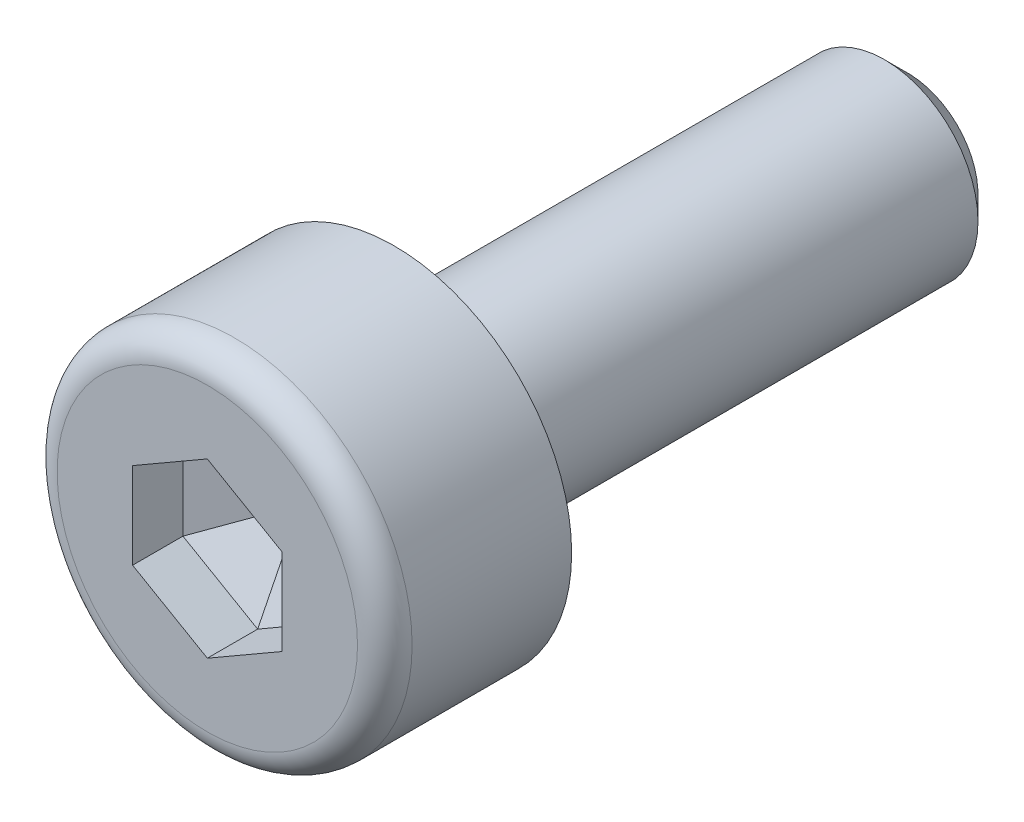
ISO-10303-21;
HEADER;
FILE_DESCRIPTION(('STEP AP214'),'2;1');
FILE_NAME('part.step','',(''),(''),'','','');
FILE_SCHEMA(('AUTOMOTIVE_DESIGN { 1 0 10303 214 1 1 1 1 }'));
ENDSEC;
DATA;
#1=APPLICATION_CONTEXT('core data for automotive mechanical design processes');
#2=APPLICATION_PROTOCOL_DEFINITION('international standard','automotive_design',2000,#1);
#3=PRODUCT_CONTEXT('',#1,'mechanical');
#4=PRODUCT('Part','Part','',(#3));
#5=PRODUCT_RELATED_PRODUCT_CATEGORY('part','',(#4));
#6=PRODUCT_DEFINITION_FORMATION('','',#4);
#7=PRODUCT_DEFINITION_CONTEXT('part definition',#1,'design');
#8=PRODUCT_DEFINITION('design','',#6,#7);
#9=PRODUCT_DEFINITION_SHAPE('','',#8);
#10=(LENGTH_UNIT() NAMED_UNIT(*) SI_UNIT(.MILLI.,.METRE.));
#11=(NAMED_UNIT(*) PLANE_ANGLE_UNIT() SI_UNIT($,.RADIAN.));
#12=(NAMED_UNIT(*) SI_UNIT($,.STERADIAN.) SOLID_ANGLE_UNIT());
#13=UNCERTAINTY_MEASURE_WITH_UNIT(LENGTH_MEASURE(1.E-05),#10,'distance_accuracy_value','');
#14=(GEOMETRIC_REPRESENTATION_CONTEXT(3) GLOBAL_UNCERTAINTY_ASSIGNED_CONTEXT((#13)) GLOBAL_UNIT_ASSIGNED_CONTEXT((#10,
#11,#12)) REPRESENTATION_CONTEXT('',''));
#15=CARTESIAN_POINT('',(0.,0.,0.));
#16=DIRECTION('',(0.,0.,1.));
#17=DIRECTION('',(1.,0.,0.));
#18=AXIS2_PLACEMENT_3D('',#15,#16,#17);
#19=CARTESIAN_POINT('',(0.,0.,0.));
#20=DIRECTION('',(0.,0.,1.));
#21=DIRECTION('',(1.,0.,0.));
#22=AXIS2_PLACEMENT_3D('',#19,#20,#21);
#23=PLANE('',#22);
#24=CARTESIAN_POINT('',(0.,0.,0.));
#25=DIRECTION('',(0.,0.,1.));
#26=DIRECTION('',(1.,0.,0.));
#27=AXIS2_PLACEMENT_3D('',#24,#25,#26);
#28=CIRCLE('',#27,1.1);
#29=CARTESIAN_POINT('',(1.1,0.,0.));
#30=VERTEX_POINT('',#29);
#31=EDGE_CURVE('E11',#30,#30,#28,.T.);
#32=ORIENTED_EDGE('',*,*,#31,.T.);
#33=EDGE_LOOP('',(#32));
#34=FACE_BOUND('',#33,.T.);
#35=CARTESIAN_POINT('',(0.,0.,0.));
#36=DIRECTION('',(0.,0.,1.));
#37=DIRECTION('',(1.,0.,0.));
#38=AXIS2_PLACEMENT_3D('',#35,#36,#37);
#39=CIRCLE('',#38,1.9);
#40=CARTESIAN_POINT('',(1.9,0.,0.));
#41=VERTEX_POINT('',#40);
#42=EDGE_CURVE('E159',#41,#41,#39,.T.);
#43=ORIENTED_EDGE('',*,*,#42,.F.);
#44=EDGE_LOOP('',(#43));
#45=FACE_BOUND('',#44,.T.);
#46=ADVANCED_FACE('F49',(#34,#45),#23,.F.);
#47=CARTESIAN_POINT('',(0.,0.,2.));
#48=DIRECTION('',(0.,0.,-1.));
#49=DIRECTION('',(-1.,0.,0.));
#50=AXIS2_PLACEMENT_3D('',#47,#48,#49);
#51=CYLINDRICAL_SURFACE('',#50,1.9);
#52=CARTESIAN_POINT('',(0.,0.,1.70769230769231));
#53=DIRECTION('',(0.,0.,1.));
#54=DIRECTION('',(1.,0.,0.));
#55=AXIS2_PLACEMENT_3D('',#52,#53,#54);
#56=CIRCLE('',#55,1.9);
#57=CARTESIAN_POINT('',(1.9,0.,1.70769230769231));
#58=VERTEX_POINT('',#57);
#59=EDGE_CURVE('E177',#58,#58,#56,.F.);
#60=ORIENTED_EDGE('',*,*,#59,.T.);
#61=EDGE_LOOP('',(#60));
#62=FACE_BOUND('',#61,.T.);
#63=ORIENTED_EDGE('',*,*,#42,.T.);
#64=EDGE_LOOP('',(#63));
#65=FACE_BOUND('',#64,.T.);
#66=ADVANCED_FACE('F236',(#62,#65),#51,.T.);
#67=CARTESIAN_POINT('',(0.,0.,2.));
#68=DIRECTION('',(0.,0.,1.));
#69=DIRECTION('',(1.,0.,0.));
#70=AXIS2_PLACEMENT_3D('',#67,#68,#69);
#71=PLANE('',#70);
#72=CARTESIAN_POINT('',(0.,0.,2.));
#73=DIRECTION('',(0.,0.,1.));
#74=DIRECTION('',(1.,0.,0.));
#75=AXIS2_PLACEMENT_3D('',#72,#73,#74);
#76=CIRCLE('',#75,1.60769230769231);
#77=CARTESIAN_POINT('',(1.60769230769231,0.,2.));
#78=VERTEX_POINT('',#77);
#79=EDGE_CURVE('E174',#78,#78,#76,.T.);
#80=ORIENTED_EDGE('',*,*,#79,.T.);
#81=EDGE_LOOP('',(#80));
#82=FACE_BOUND('',#81,.T.);
#83=DIRECTION('',(0.,1.,0.));
#84=VECTOR('',#83,1.);
#85=CARTESIAN_POINT('',(0.8,-0.461880215351701,2.));
#86=LINE('',#85,#84);
#87=CARTESIAN_POINT('',(0.8,-0.461880215351701,2.));
#88=VERTEX_POINT('',#87);
#89=CARTESIAN_POINT('',(0.8,0.461880215351701,2.));
#90=VERTEX_POINT('',#89);
#91=EDGE_CURVE('E141',#88,#90,#86,.T.);
#92=ORIENTED_EDGE('',*,*,#91,.F.);
#93=DIRECTION('',(0.866025403784439,0.5,0.));
#94=VECTOR('',#93,1.);
#95=CARTESIAN_POINT('',(0.,-0.923760430703401,2.));
#96=LINE('',#95,#94);
#97=CARTESIAN_POINT('',(0.,-0.923760430703401,2.));
#98=VERTEX_POINT('',#97);
#99=EDGE_CURVE('E154',#98,#88,#96,.T.);
#100=ORIENTED_EDGE('',*,*,#99,.F.);
#101=DIRECTION('',(0.866025403784439,-0.5,0.));
#102=VECTOR('',#101,1.);
#103=CARTESIAN_POINT('',(-0.8,-0.4618802153517,2.));
#104=LINE('',#103,#102);
#105=CARTESIAN_POINT('',(-0.8,-0.4618802153517,2.));
#106=VERTEX_POINT('',#105);
#107=EDGE_CURVE('E148',#106,#98,#104,.T.);
#108=ORIENTED_EDGE('',*,*,#107,.F.);
#109=DIRECTION('',(0.,-1.,0.));
#110=VECTOR('',#109,1.);
#111=CARTESIAN_POINT('',(-0.8,0.461880215351701,2.));
#112=LINE('',#111,#110);
#113=CARTESIAN_POINT('',(-0.8,0.461880215351701,2.));
#114=VERTEX_POINT('',#113);
#115=EDGE_CURVE('E146',#114,#106,#112,.T.);
#116=ORIENTED_EDGE('',*,*,#115,.F.);
#117=DIRECTION('',(-0.866025403784439,-0.5,0.));
#118=VECTOR('',#117,1.);
#119=CARTESIAN_POINT('',(0.,0.923760430703401,2.));
#120=LINE('',#119,#118);
#121=CARTESIAN_POINT('',(0.,0.923760430703401,2.));
#122=VERTEX_POINT('',#121);
#123=EDGE_CURVE('E126',#122,#114,#120,.T.);
#124=ORIENTED_EDGE('',*,*,#123,.F.);
#125=DIRECTION('',(-0.866025403784439,0.5,0.));
#126=VECTOR('',#125,1.);
#127=CARTESIAN_POINT('',(0.8,0.461880215351701,2.));
#128=LINE('',#127,#126);
#129=EDGE_CURVE('E136',#90,#122,#128,.T.);
#130=ORIENTED_EDGE('',*,*,#129,.F.);
#131=EDGE_LOOP('',(#92,#100,#108,#116,#124,#130));
#132=FACE_BOUND('',#131,.T.);
#133=ADVANCED_FACE('F143',(#82,#132),#71,.T.);
#134=CARTESIAN_POINT('',(0.8,-0.461880215351701,1.));
#135=DIRECTION('',(1.,0.,0.));
#136=DIRECTION('',(0.,1.,0.));
#137=AXIS2_PLACEMENT_3D('',#134,#135,#136);
#138=PLANE('',#137);
#139=DIRECTION('',(0.,0.,1.));
#140=VECTOR('',#139,1.);
#141=CARTESIAN_POINT('',(0.8,0.461880215351701,1.));
#142=LINE('',#141,#140);
#143=CARTESIAN_POINT('',(0.8,0.461880215351701,1.46109510086455));
#144=VERTEX_POINT('',#143);
#145=EDGE_CURVE('E133',#144,#90,#142,.T.);
#146=ORIENTED_EDGE('',*,*,#145,.F.);
#147=DIRECTION('',(0.,-1.,0.));
#148=VECTOR('',#147,1.);
#149=CARTESIAN_POINT('',(0.8,-0.461880215351701,1.46109510086455));
#150=LINE('',#149,#148);
#151=CARTESIAN_POINT('',(0.8,-0.461880215351701,1.46109510086455));
#152=VERTEX_POINT('',#151);
#153=EDGE_CURVE('E72',#144,#152,#150,.T.);
#154=ORIENTED_EDGE('',*,*,#153,.T.);
#155=DIRECTION('',(0.,0.,1.));
#156=VECTOR('',#155,1.);
#157=CARTESIAN_POINT('',(0.8,-0.461880215351701,1.));
#158=LINE('',#157,#156);
#159=EDGE_CURVE('E157',#152,#88,#158,.T.);
#160=ORIENTED_EDGE('',*,*,#159,.T.);
#161=ORIENTED_EDGE('',*,*,#91,.T.);
#162=EDGE_LOOP('',(#146,#154,#160,#161));
#163=FACE_BOUND('',#162,.T.);
#164=ADVANCED_FACE('F296',(#163),#138,.F.);
#165=CARTESIAN_POINT('',(0.,-0.923760430703401,1.));
#166=DIRECTION('',(0.5,-0.866025403784439,0.));
#167=DIRECTION('',(0.866025403784439,0.5,0.));
#168=AXIS2_PLACEMENT_3D('',#165,#166,#167);
#169=PLANE('',#168);
#170=ORIENTED_EDGE('',*,*,#159,.F.);
#171=DIRECTION('',(-0.866025403784439,-0.5,0.));
#172=VECTOR('',#171,1.);
#173=CARTESIAN_POINT('',(0.,-0.923760430703401,1.46109510086455));
#174=LINE('',#173,#172);
#175=CARTESIAN_POINT('',(0.,-0.923760430703401,1.46109510086455));
#176=VERTEX_POINT('',#175);
#177=EDGE_CURVE('E64',#152,#176,#174,.T.);
#178=ORIENTED_EDGE('',*,*,#177,.T.);
#179=DIRECTION('',(0.,0.,1.));
#180=VECTOR('',#179,1.);
#181=CARTESIAN_POINT('',(0.,-0.923760430703401,1.));
#182=LINE('',#181,#180);
#183=EDGE_CURVE('E160',#176,#98,#182,.T.);
#184=ORIENTED_EDGE('',*,*,#183,.T.);
#185=ORIENTED_EDGE('',*,*,#99,.T.);
#186=EDGE_LOOP('',(#170,#178,#184,#185));
#187=FACE_BOUND('',#186,.T.);
#188=ADVANCED_FACE('F298',(#187),#169,.F.);
#189=CARTESIAN_POINT('',(-0.8,-0.4618802153517,1.));
#190=DIRECTION('',(-0.5,-0.866025403784439,0.));
#191=DIRECTION('',(0.866025403784439,-0.5,0.));
#192=AXIS2_PLACEMENT_3D('',#189,#190,#191);
#193=PLANE('',#192);
#194=ORIENTED_EDGE('',*,*,#183,.F.);
#195=DIRECTION('',(-0.866025403784439,0.5,0.));
#196=VECTOR('',#195,1.);
#197=CARTESIAN_POINT('',(-0.8,-0.4618802153517,1.46109510086455));
#198=LINE('',#197,#196);
#199=CARTESIAN_POINT('',(-0.8,-0.4618802153517,1.46109510086455));
#200=VERTEX_POINT('',#199);
#201=EDGE_CURVE('E200',#176,#200,#198,.T.);
#202=ORIENTED_EDGE('',*,*,#201,.T.);
#203=DIRECTION('',(0.,0.,1.));
#204=VECTOR('',#203,1.);
#205=CARTESIAN_POINT('',(-0.8,-0.4618802153517,1.));
#206=LINE('',#205,#204);
#207=EDGE_CURVE('E162',#200,#106,#206,.T.);
#208=ORIENTED_EDGE('',*,*,#207,.T.);
#209=ORIENTED_EDGE('',*,*,#107,.T.);
#210=EDGE_LOOP('',(#194,#202,#208,#209));
#211=FACE_BOUND('',#210,.T.);
#212=ADVANCED_FACE('F287',(#211),#193,.F.);
#213=CARTESIAN_POINT('',(-0.8,0.461880215351701,1.));
#214=DIRECTION('',(-1.,0.,0.));
#215=DIRECTION('',(0.,0.,1.));
#216=AXIS2_PLACEMENT_3D('',#213,#214,#215);
#217=PLANE('',#216);
#218=ORIENTED_EDGE('',*,*,#207,.F.);
#219=DIRECTION('',(0.,1.,0.));
#220=VECTOR('',#219,1.);
#221=CARTESIAN_POINT('',(-0.8,0.461880215351701,1.46109510086455));
#222=LINE('',#221,#220);
#223=CARTESIAN_POINT('',(-0.8,0.461880215351701,1.46109510086455));
#224=VERTEX_POINT('',#223);
#225=EDGE_CURVE('E193',#200,#224,#222,.T.);
#226=ORIENTED_EDGE('',*,*,#225,.T.);
#227=DIRECTION('',(0.,0.,1.));
#228=VECTOR('',#227,1.);
#229=CARTESIAN_POINT('',(-0.8,0.461880215351701,1.));
#230=LINE('',#229,#228);
#231=EDGE_CURVE('E132',#224,#114,#230,.T.);
#232=ORIENTED_EDGE('',*,*,#231,.T.);
#233=ORIENTED_EDGE('',*,*,#115,.T.);
#234=EDGE_LOOP('',(#218,#226,#232,#233));
#235=FACE_BOUND('',#234,.T.);
#236=ADVANCED_FACE('F290',(#235),#217,.F.);
#237=CARTESIAN_POINT('',(0.,0.923760430703401,1.));
#238=DIRECTION('',(-0.5,0.866025403784439,0.));
#239=DIRECTION('',(-0.866025403784439,-0.5,0.));
#240=AXIS2_PLACEMENT_3D('',#237,#238,#239);
#241=PLANE('',#240);
#242=ORIENTED_EDGE('',*,*,#231,.F.);
#243=DIRECTION('',(0.866025403784439,0.5,0.));
#244=VECTOR('',#243,1.);
#245=CARTESIAN_POINT('',(0.,0.923760430703401,1.46109510086455));
#246=LINE('',#245,#244);
#247=CARTESIAN_POINT('',(0.,0.923760430703401,1.46109510086455));
#248=VERTEX_POINT('',#247);
#249=EDGE_CURVE('E129',#224,#248,#246,.T.);
#250=ORIENTED_EDGE('',*,*,#249,.T.);
#251=DIRECTION('',(0.,0.,1.));
#252=VECTOR('',#251,1.);
#253=CARTESIAN_POINT('',(0.,0.923760430703401,1.));
#254=LINE('',#253,#252);
#255=EDGE_CURVE('E121',#248,#122,#254,.T.);
#256=ORIENTED_EDGE('',*,*,#255,.T.);
#257=ORIENTED_EDGE('',*,*,#123,.T.);
#258=EDGE_LOOP('',(#242,#250,#256,#257));
#259=FACE_BOUND('',#258,.T.);
#260=ADVANCED_FACE('F124',(#259),#241,.F.);
#261=CARTESIAN_POINT('',(0.8,0.461880215351701,1.));
#262=DIRECTION('',(0.5,0.866025403784439,0.));
#263=DIRECTION('',(-0.866025403784439,0.5,0.));
#264=AXIS2_PLACEMENT_3D('',#261,#262,#263);
#265=PLANE('',#264);
#266=ORIENTED_EDGE('',*,*,#255,.F.);
#267=DIRECTION('',(0.866025403784439,-0.5,0.));
#268=VECTOR('',#267,1.);
#269=CARTESIAN_POINT('',(0.8,0.461880215351701,1.46109510086455));
#270=LINE('',#269,#268);
#271=EDGE_CURVE('E197',#248,#144,#270,.T.);
#272=ORIENTED_EDGE('',*,*,#271,.T.);
#273=ORIENTED_EDGE('',*,*,#145,.T.);
#274=ORIENTED_EDGE('',*,*,#129,.T.);
#275=EDGE_LOOP('',(#266,#272,#273,#274));
#276=FACE_BOUND('',#275,.T.);
#277=ADVANCED_FACE('F137',(#276),#265,.F.);
#278=CARTESIAN_POINT('',(0.,0.,1.));
#279=DIRECTION('',(0.,0.,1.));
#280=DIRECTION('',(1.,0.,0.));
#281=AXIS2_PLACEMENT_3D('',#278,#279,#280);
#282=PLANE('',#281);
#283=DIRECTION('',(-0.866025403784439,-0.5,0.));
#284=VECTOR('',#283,1.);
#285=CARTESIAN_POINT('',(-0.000679929090744374,0.00117767173071337,1.));
#286=LINE('',#285,#284);
#287=CARTESIAN_POINT('',(0.,0.0015702289742842,1.));
#288=VERTEX_POINT('',#287);
#289=CARTESIAN_POINT('',(-0.00135985818148849,0.0007851144871424,1.));
#290=VERTEX_POINT('',#289);
#291=EDGE_CURVE('E188',#288,#290,#286,.T.);
#292=ORIENTED_EDGE('',*,*,#291,.T.);
#293=DIRECTION('',(0.,-1.,0.));
#294=VECTOR('',#293,1.);
#295=CARTESIAN_POINT('',(-0.00135985818148848,0.,1.));
#296=LINE('',#295,#294);
#297=CARTESIAN_POINT('',(-0.00135985818148848,-0.000785114487141747,1.));
#298=VERTEX_POINT('',#297);
#299=EDGE_CURVE('E190',#290,#298,#296,.T.);
#300=ORIENTED_EDGE('',*,*,#299,.T.);
#301=DIRECTION('',(0.866025403784439,-0.5,0.));
#302=VECTOR('',#301,1.);
#303=CARTESIAN_POINT('',(-0.000679929090744089,-0.00117767173071287,1.));
#304=LINE('',#303,#302);
#305=CARTESIAN_POINT('',(0.,-0.00157022897428431,1.));
#306=VERTEX_POINT('',#305);
#307=EDGE_CURVE('E182',#298,#306,#304,.T.);
#308=ORIENTED_EDGE('',*,*,#307,.T.);
#309=DIRECTION('',(0.866025403784439,0.5,0.));
#310=VECTOR('',#309,1.);
#311=CARTESIAN_POINT('',(0.000679929090744482,-0.00117767173071355,1.));
#312=LINE('',#311,#310);
#313=CARTESIAN_POINT('',(0.00135985818148853,-0.000785114487142602,1.));
#314=VERTEX_POINT('',#313);
#315=EDGE_CURVE('E180',#306,#314,#312,.T.);
#316=ORIENTED_EDGE('',*,*,#315,.T.);
#317=DIRECTION('',(0.,1.,0.));
#318=VECTOR('',#317,1.);
#319=CARTESIAN_POINT('',(0.00135985818148853,0.,1.));
#320=LINE('',#319,#318);
#321=CARTESIAN_POINT('',(0.00135985818148853,0.000785114487141799,1.));
#322=VERTEX_POINT('',#321);
#323=EDGE_CURVE('E184',#314,#322,#320,.T.);
#324=ORIENTED_EDGE('',*,*,#323,.T.);
#325=DIRECTION('',(-0.866025403784439,0.5,0.));
#326=VECTOR('',#325,1.);
#327=CARTESIAN_POINT('',(0.00067992909074413,0.00117767173071294,1.));
#328=LINE('',#327,#326);
#329=EDGE_CURVE('E186',#322,#288,#328,.T.);
#330=ORIENTED_EDGE('',*,*,#329,.T.);
#331=EDGE_LOOP('',(#292,#300,#308,#316,#324,#330));
#332=FACE_BOUND('',#331,.T.);
#333=ADVANCED_FACE('F307',(#332),#282,.T.);
#334=CARTESIAN_POINT('',(0.,0.,-5.5));
#335=DIRECTION('',(0.,0.,1.));
#336=DIRECTION('',(1.,0.,0.));
#337=AXIS2_PLACEMENT_3D('',#334,#335,#336);
#338=CYLINDRICAL_SURFACE('',#337,1.);
#339=CARTESIAN_POINT('',(0.,0.,-0.1));
#340=DIRECTION('',(0.,0.,1.));
#341=DIRECTION('',(1.,0.,0.));
#342=AXIS2_PLACEMENT_3D('',#339,#340,#341);
#343=CIRCLE('',#342,1.);
#344=CARTESIAN_POINT('',(1.,0.,-0.1));
#345=VERTEX_POINT('',#344);
#346=EDGE_CURVE('E57',#345,#345,#343,.F.);
#347=ORIENTED_EDGE('',*,*,#346,.T.);
#348=EDGE_LOOP('',(#347));
#349=FACE_BOUND('',#348,.T.);
#350=CARTESIAN_POINT('',(0.,0.,-5.25));
#351=DIRECTION('',(0.,0.,-1.));
#352=DIRECTION('',(-1.,0.,0.));
#353=AXIS2_PLACEMENT_3D('',#350,#351,#352);
#354=CIRCLE('',#353,1.);
#355=CARTESIAN_POINT('',(-1.,0.,-5.25));
#356=VERTEX_POINT('',#355);
#357=EDGE_CURVE('E171',#356,#356,#354,.F.);
#358=ORIENTED_EDGE('',*,*,#357,.T.);
#359=EDGE_LOOP('',(#358));
#360=FACE_BOUND('',#359,.T.);
#361=ADVANCED_FACE('F221',(#349,#360),#338,.T.);
#362=CARTESIAN_POINT('',(0.,0.,-5.5));
#363=DIRECTION('',(0.,0.,-1.));
#364=DIRECTION('',(-1.,0.,0.));
#365=AXIS2_PLACEMENT_3D('',#362,#363,#364);
#366=PLANE('',#365);
#367=CARTESIAN_POINT('',(0.,0.,-5.5));
#368=DIRECTION('',(0.,0.,-1.));
#369=DIRECTION('',(-1.,0.,0.));
#370=AXIS2_PLACEMENT_3D('',#367,#368,#369);
#371=CIRCLE('',#370,0.75);
#372=CARTESIAN_POINT('',(-0.75,0.,-5.5));
#373=VERTEX_POINT('',#372);
#374=EDGE_CURVE('E168',#373,#373,#371,.T.);
#375=ORIENTED_EDGE('',*,*,#374,.T.);
#376=EDGE_LOOP('',(#375));
#377=FACE_BOUND('',#376,.T.);
#378=ADVANCED_FACE('F252',(#377),#366,.T.);
#379=CARTESIAN_POINT('',(0.,0.,-5.5));
#380=DIRECTION('',(0.,0.,1.));
#381=DIRECTION('',(1.,0.,0.));
#382=AXIS2_PLACEMENT_3D('',#379,#380,#381);
#383=CONICAL_SURFACE('',#382,0.75,0.785398163397447);
#384=ORIENTED_EDGE('',*,*,#357,.F.);
#385=EDGE_LOOP('',(#384));
#386=FACE_BOUND('',#385,.T.);
#387=ORIENTED_EDGE('',*,*,#374,.F.);
#388=EDGE_LOOP('',(#387));
#389=FACE_BOUND('',#388,.T.);
#390=ADVANCED_FACE('F248',(#386,#389),#383,.T.);
#391=CARTESIAN_POINT('',(0.,0.,1.70769230769231));
#392=DIRECTION('',(0.,0.,1.));
#393=DIRECTION('',(1.,0.,0.));
#394=AXIS2_PLACEMENT_3D('',#391,#392,#393);
#395=TOROIDAL_SURFACE('',#394,1.60769230769231,0.292307692307692);
#396=ORIENTED_EDGE('',*,*,#59,.F.);
#397=EDGE_LOOP('',(#396));
#398=FACE_BOUND('',#397,.T.);
#399=ORIENTED_EDGE('',*,*,#79,.F.);
#400=EDGE_LOOP('',(#399));
#401=FACE_BOUND('',#400,.T.);
#402=ADVANCED_FACE('F251',(#398,#401),#395,.T.);
#403=CARTESIAN_POINT('',(0.00135985818148853,0.,1.));
#404=DIRECTION('',(0.499999999999995,0.,-0.866025403784442));
#405=DIRECTION('',(0.,1.,0.));
#406=AXIS2_PLACEMENT_3D('',#403,#404,#405);
#407=PLANE('',#406);
#408=DIRECTION('',(-0.774596669241486,0.447213595499959,-0.447213595499953));
#409=VECTOR('',#408,1.);
#410=CARTESIAN_POINT('',(0.00108788654519065,-0.000628091589714094,0.999842977102572));
#411=LINE('',#410,#409);
#412=EDGE_CURVE('E213',#152,#314,#411,.T.);
#413=ORIENTED_EDGE('',*,*,#412,.F.);
#414=ORIENTED_EDGE('',*,*,#153,.F.);
#415=DIRECTION('',(-0.774596669241485,-0.44721359549996,-0.447213595499953));
#416=VECTOR('',#415,1.);
#417=CARTESIAN_POINT('',(0.00108788654519076,0.000628091589713315,0.999842977102572));
#418=LINE('',#417,#416);
#419=EDGE_CURVE('E216',#322,#144,#418,.F.);
#420=ORIENTED_EDGE('',*,*,#419,.F.);
#421=ORIENTED_EDGE('',*,*,#323,.F.);
#422=EDGE_LOOP('',(#413,#414,#420,#421));
#423=FACE_BOUND('',#422,.T.);
#424=ADVANCED_FACE('F255',(#423),#407,.F.);
#425=CARTESIAN_POINT('',(0.000679929090744116,0.00117767173071292,1.));
#426=DIRECTION('',(0.249999999999997,0.433012701892215,-0.866025403784442));
#427=DIRECTION('',(-0.866025403784439,0.5,0.));
#428=AXIS2_PLACEMENT_3D('',#425,#426,#427);
#429=PLANE('',#428);
#430=ORIENTED_EDGE('',*,*,#419,.T.);
#431=ORIENTED_EDGE('',*,*,#271,.F.);
#432=DIRECTION('',(0.,-0.894427190999918,-0.447213595499953));
#433=VECTOR('',#432,1.);
#434=CARTESIAN_POINT('',(0.,0.00125618317942748,0.999842977102572));
#435=LINE('',#434,#433);
#436=EDGE_CURVE('E210',#288,#248,#435,.F.);
#437=ORIENTED_EDGE('',*,*,#436,.F.);
#438=ORIENTED_EDGE('',*,*,#329,.F.);
#439=EDGE_LOOP('',(#430,#431,#437,#438));
#440=FACE_BOUND('',#439,.T.);
#441=ADVANCED_FACE('F268',(#440),#429,.F.);
#442=CARTESIAN_POINT('',(0.000679929090744482,-0.00117767173071355,1.));
#443=DIRECTION('',(0.249999999999997,-0.433012701892215,-0.866025403784442));
#444=DIRECTION('',(0.866025403784439,0.5,0.));
#445=AXIS2_PLACEMENT_3D('',#442,#443,#444);
#446=PLANE('',#445);
#447=ORIENTED_EDGE('',*,*,#412,.T.);
#448=ORIENTED_EDGE('',*,*,#315,.F.);
#449=DIRECTION('',(0.,-0.894427190999919,0.447213595499953));
#450=VECTOR('',#449,1.);
#451=CARTESIAN_POINT('',(0.,-0.00125618317942715,0.999842977102572));
#452=LINE('',#451,#450);
#453=EDGE_CURVE('E207',#176,#306,#452,.F.);
#454=ORIENTED_EDGE('',*,*,#453,.F.);
#455=ORIENTED_EDGE('',*,*,#177,.F.);
#456=EDGE_LOOP('',(#447,#448,#454,#455));
#457=FACE_BOUND('',#456,.T.);
#458=ADVANCED_FACE('F264',(#457),#446,.F.);
#459=CARTESIAN_POINT('',(-0.000679929090744346,0.00117767173071332,1.));
#460=DIRECTION('',(-0.249999999999997,0.433012701892215,-0.866025403784442));
#461=DIRECTION('',(-0.866025403784439,-0.5,0.));
#462=AXIS2_PLACEMENT_3D('',#459,#460,#461);
#463=PLANE('',#462);
#464=ORIENTED_EDGE('',*,*,#436,.T.);
#465=ORIENTED_EDGE('',*,*,#249,.F.);
#466=DIRECTION('',(0.774596669241486,-0.447213595499959,-0.447213595499953));
#467=VECTOR('',#466,1.);
#468=CARTESIAN_POINT('',(-0.00108788654519069,0.000628091589713869,0.999842977102572));
#469=LINE('',#468,#467);
#470=EDGE_CURVE('E205',#290,#224,#469,.F.);
#471=ORIENTED_EDGE('',*,*,#470,.F.);
#472=ORIENTED_EDGE('',*,*,#291,.F.);
#473=EDGE_LOOP('',(#464,#465,#471,#472));
#474=FACE_BOUND('',#473,.T.);
#475=ADVANCED_FACE('F260',(#474),#463,.F.);
#476=CARTESIAN_POINT('',(-0.000679929090744089,-0.00117767173071287,1.));
#477=DIRECTION('',(-0.249999999999997,-0.433012701892215,-0.866025403784442));
#478=DIRECTION('',(0.866025403784439,-0.5,0.));
#479=AXIS2_PLACEMENT_3D('',#476,#477,#478);
#480=PLANE('',#479);
#481=ORIENTED_EDGE('',*,*,#453,.T.);
#482=ORIENTED_EDGE('',*,*,#307,.F.);
#483=DIRECTION('',(-0.774596669241485,-0.447213595499959,0.447213595499953));
#484=VECTOR('',#483,1.);
#485=CARTESIAN_POINT('',(-0.0010878865451909,-0.000628091589713393,0.999842977102572));
#486=LINE('',#485,#484);
#487=EDGE_CURVE('E203',#200,#298,#486,.F.);
#488=ORIENTED_EDGE('',*,*,#487,.F.);
#489=ORIENTED_EDGE('',*,*,#201,.F.);
#490=EDGE_LOOP('',(#481,#482,#488,#489));
#491=FACE_BOUND('',#490,.T.);
#492=ADVANCED_FACE('F231',(#491),#480,.F.);
#493=CARTESIAN_POINT('',(-0.00135985818148848,0.,1.));
#494=DIRECTION('',(-0.499999999999995,0.,-0.866025403784442));
#495=DIRECTION('',(0.,-1.,0.));
#496=AXIS2_PLACEMENT_3D('',#493,#494,#495);
#497=PLANE('',#496);
#498=ORIENTED_EDGE('',*,*,#470,.T.);
#499=ORIENTED_EDGE('',*,*,#225,.F.);
#500=ORIENTED_EDGE('',*,*,#487,.T.);
#501=ORIENTED_EDGE('',*,*,#299,.F.);
#502=EDGE_LOOP('',(#498,#499,#500,#501));
#503=FACE_BOUND('',#502,.T.);
#504=ADVANCED_FACE('F225',(#503),#497,.F.);
#505=CARTESIAN_POINT('',(0.,0.,-0.1));
#506=DIRECTION('',(0.,0.,1.));
#507=DIRECTION('',(1.,0.,0.));
#508=AXIS2_PLACEMENT_3D('',#505,#506,#507);
#509=TOROIDAL_SURFACE('',#508,1.1,0.1);
#510=ORIENTED_EDGE('',*,*,#31,.F.);
#511=EDGE_LOOP('',(#510));
#512=FACE_BOUND('',#511,.T.);
#513=ORIENTED_EDGE('',*,*,#346,.F.);
#514=EDGE_LOOP('',(#513));
#515=FACE_BOUND('',#514,.T.);
#516=ADVANCED_FACE('F51',(#512,#515),#509,.F.);
#517=CLOSED_SHELL('',(#46,#66,#133,#164,#188,#212,#236,#260,#277,#333,#361,#378,#390,#402,#424,
#441,#458,#475,#492,#504,#516));
#518=MANIFOLD_SOLID_BREP('B2',#517);
#519=ADVANCED_BREP_SHAPE_REPRESENTATION('',(#18,#518),#14);
#520=SHAPE_DEFINITION_REPRESENTATION(#9,#519);
ENDSEC;
END-ISO-10303-21;
